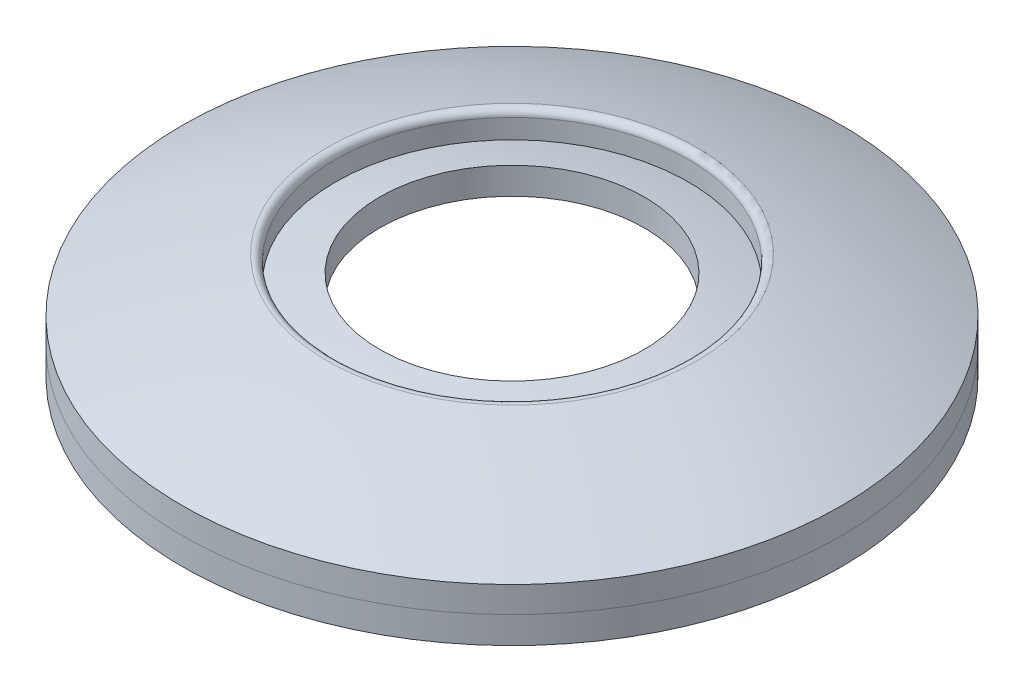
ISO-10303-21;
HEADER;
FILE_DESCRIPTION(('STEP AP214'),'2;1');
FILE_NAME('part.step','',(''),(''),'','','');
FILE_SCHEMA(('AUTOMOTIVE_DESIGN { 1 0 10303 214 1 1 1 1 }'));
ENDSEC;
DATA;
#1=APPLICATION_CONTEXT('core data for automotive mechanical design processes');
#2=APPLICATION_PROTOCOL_DEFINITION('international standard','automotive_design',2000,#1);
#3=PRODUCT_CONTEXT('',#1,'mechanical');
#4=PRODUCT('Part','Part','',(#3));
#5=PRODUCT_RELATED_PRODUCT_CATEGORY('part','',(#4));
#6=PRODUCT_DEFINITION_FORMATION('','',#4);
#7=PRODUCT_DEFINITION_CONTEXT('part definition',#1,'design');
#8=PRODUCT_DEFINITION('design','',#6,#7);
#9=PRODUCT_DEFINITION_SHAPE('','',#8);
#10=(LENGTH_UNIT() NAMED_UNIT(*) SI_UNIT(.MILLI.,.METRE.));
#11=(NAMED_UNIT(*) PLANE_ANGLE_UNIT() SI_UNIT($,.RADIAN.));
#12=(NAMED_UNIT(*) SI_UNIT($,.STERADIAN.) SOLID_ANGLE_UNIT());
#13=UNCERTAINTY_MEASURE_WITH_UNIT(LENGTH_MEASURE(1.E-05),#10,'distance_accuracy_value','');
#14=(GEOMETRIC_REPRESENTATION_CONTEXT(3) GLOBAL_UNCERTAINTY_ASSIGNED_CONTEXT((#13)) GLOBAL_UNIT_ASSIGNED_CONTEXT((#10,
#11,#12)) REPRESENTATION_CONTEXT('',''));
#15=CARTESIAN_POINT('',(0.,0.,0.));
#16=DIRECTION('',(0.,0.,1.));
#17=DIRECTION('',(1.,0.,0.));
#18=AXIS2_PLACEMENT_3D('',#15,#16,#17);
#19=CARTESIAN_POINT('',(-10.287,-0.819150000000003,0.));
#20=DIRECTION('',(0.,-1.,0.));
#21=DIRECTION('',(1.,0.,0.));
#22=AXIS2_PLACEMENT_3D('',#19,#20,#21);
#23=PLANE('',#22);
#24=CARTESIAN_POINT('',(0.,-0.81915,0.));
#25=DIRECTION('',(0.,-1.,0.));
#26=DIRECTION('',(1.,0.,0.));
#27=AXIS2_PLACEMENT_3D('',#24,#25,#26);
#28=CIRCLE('',#27,10.287);
#29=CARTESIAN_POINT('',(10.287,-0.819149999999999,0.));
#30=VERTEX_POINT('',#29);
#31=EDGE_CURVE('E83',#30,#30,#28,.T.);
#32=ORIENTED_EDGE('',*,*,#31,.F.);
#33=EDGE_LOOP('',(#32));
#34=FACE_BOUND('',#33,.T.);
#35=CARTESIAN_POINT('',(0.,-0.819150000000003,0.));
#36=DIRECTION('',(0.,-1.,0.));
#37=DIRECTION('',(1.,0.,0.));
#38=AXIS2_PLACEMENT_3D('',#35,#36,#37);
#39=CIRCLE('',#38,10.1546963657216);
#40=CARTESIAN_POINT('',(-10.1546963657216,-0.819150000000005,0.));
#41=VERTEX_POINT('',#40);
#42=EDGE_CURVE('E11',#41,#41,#39,.T.);
#43=ORIENTED_EDGE('',*,*,#42,.T.);
#44=EDGE_LOOP('',(#43));
#45=FACE_BOUND('',#44,.T.);
#46=ADVANCED_FACE('F55',(#34,#45),#23,.F.);
#47=CARTESIAN_POINT('',(0.,-21.8475870229007,0.));
#48=DIRECTION('',(0.,-1.,0.));
#49=DIRECTION('',(-1.,0.,0.));
#50=AXIS2_PLACEMENT_3D('',#47,#48,#49);
#51=SPHERICAL_SURFACE('',#50,23.3519382901313);
#52=CARTESIAN_POINT('',(0.,1.13668511384752,0.));
#53=DIRECTION('',(0.,-1.,0.));
#54=DIRECTION('',(1.,0.,0.));
#55=AXIS2_PLACEMENT_3D('',#52,#53,#54);
#56=CIRCLE('',#55,4.1275);
#57=CARTESIAN_POINT('',(-4.1275,1.13668511384753,0.));
#58=VERTEX_POINT('',#57);
#59=EDGE_CURVE('E62',#58,#58,#56,.T.);
#60=CARTESIAN_POINT('',(-10.1546963657216,-0.819150000000005,0.));
#61=CARTESIAN_POINT('',(-10.0950738926482,-0.79035811780622,0.));
#62=CARTESIAN_POINT('',(-10.0353289618888,-0.761819822343253,0.));
#63=CARTESIAN_POINT('',(-9.9155985213453,-0.705252440603446,0.));
#64=CARTESIAN_POINT('',(-9.85561301156113,-0.677223354326605,0.));
#65=CARTESIAN_POINT('',(-9.73540574931505,-0.62167642668354,0.));
#66=CARTESIAN_POINT('',(-9.67518399685315,-0.594158585317315,0.));
#67=CARTESIAN_POINT('',(-9.55450860735511,-0.539636136359009,0.));
#68=CARTESIAN_POINT('',(-9.49405497031897,-0.512631528766927,0.));
#69=CARTESIAN_POINT('',(-9.37292018530338,-0.45913750173247,0.));
#70=CARTESIAN_POINT('',(-9.31223903732392,-0.432648082290095,0.));
#71=CARTESIAN_POINT('',(-9.19065362084817,-0.380186347947361,0.));
#72=CARTESIAN_POINT('',(-9.12974935235188,-0.354214033047004,0.));
#73=CARTESIAN_POINT('',(-9.00772210132224,-0.302788386957372,0.));
#74=CARTESIAN_POINT('',(-8.9465991187889,-0.277335055768097,0.));
#75=CARTESIAN_POINT('',(-8.82413886201324,-0.226949218669709,0.));
#76=CARTESIAN_POINT('',(-8.76280158777091,-0.202016712760596,0.));
#77=CARTESIAN_POINT('',(-8.63991718540318,-0.152674330122883,0.));
#78=CARTESIAN_POINT('',(-8.57837005727778,-0.128264453394283,0.));
#79=CARTESIAN_POINT('',(-8.45507040015468,-0.0799690952014429,0.));
#80=CARTESIAN_POINT('',(-8.39331787115699,-0.0560836137372026,0.));
#81=CARTESIAN_POINT('',(-8.26961188016067,-0.00883877421725313,0.));
#82=CARTESIAN_POINT('',(-8.20765841816205,0.0145205838384562,0.));
#83=CARTESIAN_POINT('',(-8.08355504357309,0.0607114864631023,0.));
#84=CARTESIAN_POINT('',(-8.02140513098275,0.0835430310320392,0.));
#85=CARTESIAN_POINT('',(-7.896913351833,0.128676654792788,0.));
#86=CARTESIAN_POINT('',(-7.83457148527358,0.150978733984599,0.));
#87=CARTESIAN_POINT('',(-7.70970030869642,0.19505181340823,0.));
#88=CARTESIAN_POINT('',(-7.64717099867867,0.216822813640049,0.));
#89=CARTESIAN_POINT('',(-7.52192945925735,0.259832159985048,0.));
#90=CARTESIAN_POINT('',(-7.45921722985377,0.281070506098227,0.));
#91=CARTESIAN_POINT('',(-7.33361438896775,0.323013007585472,0.));
#92=CARTESIAN_POINT('',(-7.2707237774853,0.343717162959538,0.));
#93=CARTESIAN_POINT('',(-7.14476872265465,0.384589784997444,0.));
#94=CARTESIAN_POINT('',(-7.08170427930644,0.404758251661285,0.));
#95=CARTESIAN_POINT('',(-6.95540612353433,0.444558037065364,0.));
#96=CARTESIAN_POINT('',(-6.89217241111043,0.464189355805603,0.));
#97=CARTESIAN_POINT('',(-6.76554029222382,0.502913425012416,0.));
#98=CARTESIAN_POINT('',(-6.70214188576111,0.52200617547899,0.));
#99=CARTESIAN_POINT('',(-6.57518496574959,0.559651726754485,0.));
#100=CARTESIAN_POINT('',(-6.51162645220078,0.578204527563407,0.));
#101=CARTESIAN_POINT('',(-6.38435391655371,0.614768837205635,0.));
#102=CARTESIAN_POINT('',(-6.32063989445545,0.632780346038942,0.));
#103=CARTESIAN_POINT('',(-6.19306095149737,0.668260768575128,0.));
#104=CARTESIAN_POINT('',(-6.12919603063755,0.685729682278006,0.));
#105=CARTESIAN_POINT('',(-6.00131991086193,0.720123650655881,0.));
#106=CARTESIAN_POINT('',(-5.93730871194614,0.737048705330877,0.));
#107=CARTESIAN_POINT('',(-5.80914466734761,0.770353731104682,0.));
#108=CARTESIAN_POINT('',(-5.74499182166487,0.786733702203491,0.));
#109=CARTESIAN_POINT('',(-5.61654912506961,0.81894737571302,0.));
#110=CARTESIAN_POINT('',(-5.55225927415708,0.834781078123742,0.));
#111=CARTESIAN_POINT('',(-5.42354721855265,0.865901068672377,0.));
#112=CARTESIAN_POINT('',(-5.35912501386074,0.881187356810291,0.));
#113=CARTESIAN_POINT('',(-5.23015291172109,0.911211412819875,0.));
#114=CARTESIAN_POINT('',(-5.16560301427336,0.925949180691544,0.));
#115=CARTESIAN_POINT('',(-5.03638019689478,0.954875129916617,0.));
#116=CARTESIAN_POINT('',(-4.97170727696393,0.96906331127002,0.));
#117=CARTESIAN_POINT('',(-4.84224309375379,0.996889060763397,0.));
#118=CARTESIAN_POINT('',(-4.77745183047449,1.01052662890337,0.));
#119=CARTESIAN_POINT('',(-4.6477556484095,1.0372501658826,0.));
#120=CARTESIAN_POINT('',(-4.58285072962381,1.05033613472185,0.));
#121=CARTESIAN_POINT('',(-4.45293193206963,1.0759555240463,0.));
#122=CARTESIAN_POINT('',(-4.38791805330115,1.08848894453151,0.));
#123=CARTESIAN_POINT('',(-4.25778604120954,1.11300233880146,0.));
#124=CARTESIAN_POINT('',(-4.1926679078864,1.1249823125862,0.));
#125=CARTESIAN_POINT('',(-4.1275,1.13668511384753,0.));
#126=B_SPLINE_CURVE_WITH_KNOTS('',3,(#60,#61,#62,#63,#64,#65,#66,#67,#68,#69,#70,#71,#72,#73,
#74,#75,#76,#77,#78,#79,#80,#81,#82,#83,#84,#85,#86,#87,#88,#89,#90,#91,#92,#93,#94,#95,#96,#97,
#98,#99,#100,#101,#102,#103,#104,#105,#106,#107,#108,#109,#110,#111,#112,#113,#114,#115,#116,
#117,#118,#119,#120,#121,#122,#123,#124,#125),.UNSPECIFIED.,.F.,.F.,(4,2,2,2,2,2,2,2,2,2,2,2,2,
2,2,2,2,2,2,2,2,2,2,2,2,2,2,2,2,2,2,2,4),(0.,0.198630481113823,0.397260962227645,
0.595891443341466,0.794521924455287,0.993152405569116,1.19178288668294,1.39041336779676,
1.58904384891058,1.78767433002441,1.98630481113823,2.18493529225205,2.38356577336588,
2.5821962544797,2.78082673559353,2.97945721670735,3.17808769782117,3.37671817893499,
3.57534866004881,3.77397914116264,3.97260962227646,4.17124010339029,4.36987058450411,
4.56850106561793,4.76713154673175,4.96576202784558,5.1643925089594,5.36302299007322,
5.56165347118705,5.76028395230087,5.9589144334147,6.15754491452852,6.35617539564234),.UNSPECIFIED.);
#127=EDGE_CURVE('BSEAM90',#41,#58,#126,.T.);
#128=ORIENTED_EDGE('',*,*,#42,.F.);
#129=ORIENTED_EDGE('',*,*,#59,.T.);
#130=ORIENTED_EDGE('',*,*,#127,.T.);
#131=ORIENTED_EDGE('',*,*,#127,.F.);
#132=EDGE_LOOP('',(#128,#130,#129,#131));
#133=FACE_BOUND('',#132,.T.);
#134=ADVANCED_FACE('F90',(#133),#51,.T.);
#135=CARTESIAN_POINT('',(0.,-1.65735,0.));
#136=DIRECTION('',(0.,-1.,0.));
#137=DIRECTION('',(1.,0.,0.));
#138=AXIS2_PLACEMENT_3D('',#135,#136,#137);
#139=CYLINDRICAL_SURFACE('',#138,4.1275);
#140=ORIENTED_EDGE('',*,*,#59,.F.);
#141=EDGE_LOOP('',(#140));
#142=FACE_BOUND('',#141,.T.);
#143=CARTESIAN_POINT('',(0.,0.298485113847527,0.));
#144=DIRECTION('',(0.,-1.,0.));
#145=DIRECTION('',(1.,0.,0.));
#146=AXIS2_PLACEMENT_3D('',#143,#144,#145);
#147=CIRCLE('',#146,4.1275);
#148=CARTESIAN_POINT('',(-4.1275,0.298485113847526,0.));
#149=VERTEX_POINT('',#148);
#150=EDGE_CURVE('E68',#149,#149,#147,.T.);
#151=ORIENTED_EDGE('',*,*,#150,.T.);
#152=EDGE_LOOP('',(#151));
#153=FACE_BOUND('',#152,.T.);
#154=ADVANCED_FACE('F95',(#142,#153),#139,.F.);
#155=CARTESIAN_POINT('',(0.,-21.8475870229007,0.));
#156=DIRECTION('',(0.,-1.,0.));
#157=DIRECTION('',(-1.,0.,0.));
#158=AXIS2_PLACEMENT_3D('',#155,#156,#157);
#159=SPHERICAL_SURFACE('',#158,22.5274225630909);
#160=CARTESIAN_POINT('',(0.,-1.65735,0.));
#161=DIRECTION('',(0.,-1.,0.));
#162=DIRECTION('',(1.,0.,0.));
#163=AXIS2_PLACEMENT_3D('',#160,#161,#162);
#164=CIRCLE('',#163,9.99195157590079);
#165=CARTESIAN_POINT('',(-9.99195157590079,-1.65735,0.));
#166=VERTEX_POINT('',#165);
#167=EDGE_CURVE('E74',#166,#166,#164,.T.);
#168=CARTESIAN_POINT('',(-4.1275,0.298485113847526,0.));
#169=CARTESIAN_POINT('',(-4.19100603225403,0.286649110598296,0.));
#170=CARTESIAN_POINT('',(-4.25446115036335,0.274539928465392,0.));
#171=CARTESIAN_POINT('',(-4.38126486834854,0.249776134439432,0.));
#172=CARTESIAN_POINT('',(-4.4446134682244,0.237121522546375,0.));
#173=CARTESIAN_POINT('',(-4.57119945979858,0.211267797007301,0.));
#174=CARTESIAN_POINT('',(-4.63443685149691,0.198068683361283,0.));
#175=CARTESIAN_POINT('',(-4.76079574711449,0.17112693343677,0.));
#176=CARTESIAN_POINT('',(-4.82391725103375,0.157384297158274,0.));
#177=CARTESIAN_POINT('',(-4.95003969950225,0.129356518415953,0.));
#178=CARTESIAN_POINT('',(-5.0130406440515,0.115071375952127,0.));
#179=CARTESIAN_POINT('',(-5.13891731126301,0.0859596422124376,0.));
#180=CARTESIAN_POINT('',(-5.20179303392527,0.071133050936574,0.));
#181=CARTESIAN_POINT('',(-5.32741460407258,0.0409395168093435,0.));
#182=CARTESIAN_POINT('',(-5.39016045155762,0.0255725739579765,0.));
#183=CARTESIAN_POINT('',(-5.51551762768287,-0.00570052603783919,0.));
#184=CARTESIAN_POINT('',(-5.57812895632309,-0.0216066831822878,0.));
#185=CARTESIAN_POINT('',(-5.7032124610436,-0.053957034590825,0.));
#186=CARTESIAN_POINT('',(-5.76568463712389,-0.0704012288549136,0.));
#187=CARTESIAN_POINT('',(-5.89048521330858,-0.103826437506454,0.));
#188=CARTESIAN_POINT('',(-5.95281361341297,-0.120807451893906,0.));
#189=CARTESIAN_POINT('',(-6.0773220248702,-0.155305044068187,0.));
#190=CARTESIAN_POINT('',(-6.13950203622304,-0.172821621855017,0.));
#191=CARTESIAN_POINT('',(-6.26370906838344,-0.208389044468028,0.));
#192=CARTESIAN_POINT('',(-6.325736089191,-0.22643988929421,0.));
#193=CARTESIAN_POINT('',(-6.44963254978959,-0.263074510086141,0.));
#194=CARTESIAN_POINT('',(-6.51150198958062,-0.281658286051891,0.));
#195=CARTESIAN_POINT('',(-6.63507870933707,-0.319357393782204,0.));
#196=CARTESIAN_POINT('',(-6.6967859893025,-0.338472725546767,0.));
#197=CARTESIAN_POINT('',(-6.82003382259974,-0.377233530194782,0.));
#198=CARTESIAN_POINT('',(-6.88157437593156,-0.396879003078234,0.));
#199=CARTESIAN_POINT('',(-7.00448420149262,-0.43669863604963,0.));
#200=CARTESIAN_POINT('',(-7.06585347372186,-0.456872796137575,0.));
#201=CARTESIAN_POINT('',(-7.1884161952849,-0.49774831047668,0.));
#202=CARTESIAN_POINT('',(-7.24960964461871,-0.518449664727841,0.));
#203=CARTESIAN_POINT('',(-7.37181619161024,-0.560378035335733,0.));
#204=CARTESIAN_POINT('',(-7.43282928926797,-0.581605051692464,0.));
#205=CARTESIAN_POINT('',(-7.55467061747413,-0.624583175550847,0.));
#206=CARTESIAN_POINT('',(-7.61549884802255,-0.6463342830525,0.));
#207=CARTESIAN_POINT('',(-7.73696594025843,-0.690358979453358,0.));
#208=CARTESIAN_POINT('',(-7.79760480194588,-0.712632568352564,0.));
#209=CARTESIAN_POINT('',(-7.91868866872289,-0.757700579133554,0.));
#210=CARTESIAN_POINT('',(-7.97913367381244,-0.780495001015339,0.));
#211=CARTESIAN_POINT('',(-8.09982535400358,-0.826602990800903,0.));
#212=CARTESIAN_POINT('',(-8.16007202910517,-0.849916558704684,0.));
#213=CARTESIAN_POINT('',(-8.28036259060823,-0.897061115152971,0.));
#214=CARTESIAN_POINT('',(-8.3404064770097,-0.920892103697477,0.));
#215=CARTESIAN_POINT('',(-8.46028701740837,-0.969069737752615,0.));
#216=CARTESIAN_POINT('',(-8.52012367140558,-0.993416383263247,0.));
#217=CARTESIAN_POINT('',(-8.6395853186279,-1.04262352941449,0.));
#218=CARTESIAN_POINT('',(-8.69921031185302,-1.0674840300551,0.));
#219=CARTESIAN_POINT('',(-8.81824422482961,-1.11771704659728,0.));
#220=CARTESIAN_POINT('',(-8.87765314458109,-1.14308956249886,0.));
#221=CARTESIAN_POINT('',(-8.99625051389329,-1.19434473181465,0.));
#222=CARTESIAN_POINT('',(-9.05543896345402,-1.22022738522887,0.));
#223=CARTESIAN_POINT('',(-9.17359101200887,-1.27250091401641,0.));
#224=CARTESIAN_POINT('',(-9.23255461100298,-1.29889178938974,0.));
#225=CARTESIAN_POINT('',(-9.35025259459696,-1.35217980912054,0.));
#226=CARTESIAN_POINT('',(-9.40898697919683,-1.379076953478,0.));
#227=CARTESIAN_POINT('',(-9.52622218748315,-1.43337552002218,0.));
#228=CARTESIAN_POINT('',(-9.58472301116961,-1.46077694220889,0.));
#229=CARTESIAN_POINT('',(-9.70148676710827,-1.516082038594,0.));
#230=CARTESIAN_POINT('',(-9.75974969936048,-1.5439857127924,0.));
#231=CARTESIAN_POINT('',(-9.87603336431848,-1.60029324029416,0.));
#232=CARTESIAN_POINT('',(-9.93405409702428,-1.62869709359752,0.));
#233=CARTESIAN_POINT('',(-9.99195157590079,-1.65735,0.));
#234=B_SPLINE_CURVE_WITH_KNOTS('',3,(#168,#169,#170,#171,#172,#173,#174,#175,#176,#177,#178,
#179,#180,#181,#182,#183,#184,#185,#186,#187,#188,#189,#190,#191,#192,#193,#194,#195,#196,#197,
#198,#199,#200,#201,#202,#203,#204,#205,#206,#207,#208,#209,#210,#211,#212,#213,#214,#215,#216,
#217,#218,#219,#220,#221,#222,#223,#224,#225,#226,#227,#228,#229,#230,#231,#232,#233),
.UNSPECIFIED.,.F.,.F.,(4,2,2,2,2,2,2,2,2,2,2,2,2,2,2,2,2,2,2,2,2,2,2,2,2,2,2,2,2,2,2,2,4),(0.,
0.193798174001697,0.387596348003394,0.581394522005092,0.77519269600679,0.968990870008488,
1.16278904401019,1.35658721801188,1.55038539201358,1.74418356601528,1.93798174001698,
2.13177991401868,2.32557808802038,2.51937626202208,2.71317443602377,2.90697261002547,
3.10077078402717,3.29456895802887,3.48836713203056,3.68216530603226,3.87596348003396,
4.06976165403566,4.26355982803736,4.45735800203906,4.65115617604075,4.84495435004245,
5.03875252404415,5.23255069804585,5.42634887204755,5.62014704604924,5.81394522005094,
6.00774339405264,6.20154156805434),.UNSPECIFIED.);
#235=EDGE_CURVE('BSEAM99',#149,#166,#234,.T.);
#236=ORIENTED_EDGE('',*,*,#150,.F.);
#237=ORIENTED_EDGE('',*,*,#167,.T.);
#238=ORIENTED_EDGE('',*,*,#235,.T.);
#239=ORIENTED_EDGE('',*,*,#235,.F.);
#240=EDGE_LOOP('',(#236,#238,#237,#239));
#241=FACE_BOUND('',#240,.T.);
#242=ADVANCED_FACE('F99',(#241),#159,.F.);
#243=CARTESIAN_POINT('',(-10.287,-1.65735,0.));
#244=DIRECTION('',(0.,1.,0.));
#245=DIRECTION('',(-1.,0.,0.));
#246=AXIS2_PLACEMENT_3D('',#243,#244,#245);
#247=PLANE('',#246);
#248=ORIENTED_EDGE('',*,*,#167,.F.);
#249=EDGE_LOOP('',(#248));
#250=FACE_BOUND('',#249,.T.);
#251=CARTESIAN_POINT('',(0.,-1.65735,0.));
#252=DIRECTION('',(0.,-1.,0.));
#253=DIRECTION('',(1.,0.,0.));
#254=AXIS2_PLACEMENT_3D('',#251,#252,#253);
#255=CIRCLE('',#254,10.287);
#256=CARTESIAN_POINT('',(10.287,-1.65735,0.));
#257=VERTEX_POINT('',#256);
#258=EDGE_CURVE('E80',#257,#257,#255,.T.);
#259=ORIENTED_EDGE('',*,*,#258,.T.);
#260=EDGE_LOOP('',(#259));
#261=FACE_BOUND('',#260,.T.);
#262=ADVANCED_FACE('F104',(#250,#261),#247,.F.);
#263=CARTESIAN_POINT('',(0.,-1.65735,0.));
#264=DIRECTION('',(0.,-1.,0.));
#265=DIRECTION('',(1.,0.,0.));
#266=AXIS2_PLACEMENT_3D('',#263,#264,#265);
#267=CYLINDRICAL_SURFACE('',#266,10.287);
#268=ORIENTED_EDGE('',*,*,#258,.F.);
#269=EDGE_LOOP('',(#268));
#270=FACE_BOUND('',#269,.T.);
#271=ORIENTED_EDGE('',*,*,#31,.T.);
#272=EDGE_LOOP('',(#271));
#273=FACE_BOUND('',#272,.T.);
#274=ADVANCED_FACE('F87',(#270,#273),#267,.T.);
#275=CLOSED_SHELL('',(#46,#134,#154,#242,#262,#274));
#276=MANIFOLD_SOLID_BREP('B2',#275);
#277=CARTESIAN_POINT('',(-10.287,-0.819150000000001,0.));
#278=DIRECTION('',(0.,1.,0.));
#279=DIRECTION('',(-1.,0.,0.));
#280=AXIS2_PLACEMENT_3D('',#277,#278,#279);
#281=PLANE('',#280);
#282=CARTESIAN_POINT('',(0.,-0.81915,0.));
#283=DIRECTION('',(0.,-1.,0.));
#284=DIRECTION('',(1.,0.,0.));
#285=AXIS2_PLACEMENT_3D('',#282,#283,#284);
#286=CIRCLE('',#285,10.1546963657216);
#287=CARTESIAN_POINT('',(-10.1546963657216,-0.819150000000001,0.));
#288=VERTEX_POINT('',#287);
#289=EDGE_CURVE('E54',#288,#288,#286,.T.);
#290=ORIENTED_EDGE('',*,*,#289,.F.);
#291=EDGE_LOOP('',(#290));
#292=FACE_BOUND('',#291,.T.);
#293=CARTESIAN_POINT('',(0.,-0.81915,0.));
#294=DIRECTION('',(0.,-1.,0.));
#295=DIRECTION('',(1.,0.,0.));
#296=AXIS2_PLACEMENT_3D('',#293,#294,#295);
#297=CIRCLE('',#296,10.287);
#298=CARTESIAN_POINT('',(10.287,-0.819149999999998,0.));
#299=VERTEX_POINT('',#298);
#300=EDGE_CURVE('E171',#299,#299,#297,.T.);
#301=ORIENTED_EDGE('',*,*,#300,.T.);
#302=EDGE_LOOP('',(#301));
#303=FACE_BOUND('',#302,.T.);
#304=ADVANCED_FACE('F143',(#292,#303),#281,.F.);
#305=CARTESIAN_POINT('',(0.,-21.8475870229008,0.));
#306=DIRECTION('',(0.,-1.,0.));
#307=DIRECTION('',(-1.,0.,0.));
#308=AXIS2_PLACEMENT_3D('',#305,#306,#307);
#309=SPHERICAL_SURFACE('',#308,23.3519382901314);
#310=CARTESIAN_POINT('',(0.,0.84455,0.));
#311=DIRECTION('',(0.,-1.,0.));
#312=DIRECTION('',(1.,0.,0.));
#313=AXIS2_PLACEMENT_3D('',#310,#311,#312);
#314=CIRCLE('',#313,5.5118);
#315=CARTESIAN_POINT('',(-5.51180000000002,0.844549999999996,0.));
#316=VERTEX_POINT('',#315);
#317=EDGE_CURVE('E150',#316,#316,#314,.T.);
#318=CARTESIAN_POINT('',(-5.51180000000002,0.844549999999996,0.));
#319=CARTESIAN_POINT('',(-5.56181642683611,0.832401277349449,0.));
#320=CARTESIAN_POINT('',(-5.61179268634412,0.820087185527644,0.));
#321=CARTESIAN_POINT('',(-5.71166268840982,0.795128813343484,0.));
#322=CARTESIAN_POINT('',(-5.76155643096751,0.782484532981127,0.));
#323=CARTESIAN_POINT('',(-5.86125921683842,0.756866333517823,0.));
#324=CARTESIAN_POINT('',(-5.91106826015165,0.743892414416875,0.));
#325=CARTESIAN_POINT('',(-6.01059946990958,0.71761550555972,0.));
#326=CARTESIAN_POINT('',(-6.06032163635429,0.704312515803513,0.));
#327=CARTESIAN_POINT('',(-6.15967691829067,0.677378047070767,0.));
#328=CARTESIAN_POINT('',(-6.20931003378234,0.663746568094229,0.));
#329=CARTESIAN_POINT('',(-6.30848504369115,0.636155716996214,0.));
#330=CARTESIAN_POINT('',(-6.35802693810829,0.622196344874737,0.));
#331=CARTESIAN_POINT('',(-6.45701733971647,0.593950317824459,0.));
#332=CARTESIAN_POINT('',(-6.5064658469075,0.579663662895658,0.));
#333=CARTESIAN_POINT('',(-6.60526731200007,0.550763694898265,0.));
#334=CARTESIAN_POINT('',(-6.65462026990162,0.536150381829674,0.));
#335=CARTESIAN_POINT('',(-6.75322847852827,0.506597736497539,0.));
#336=CARTESIAN_POINT('',(-6.80248372925338,0.491658404233995,0.));
#337=CARTESIAN_POINT('',(-6.90089436991265,0.461454373712947,0.));
#338=CARTESIAN_POINT('',(-6.95004975984683,0.446189675455444,0.));
#339=CARTESIAN_POINT('',(-7.04825852967592,0.415335580373235,0.));
#340=CARTESIAN_POINT('',(-7.09731190957084,0.399746183548529,0.));
#341=CARTESIAN_POINT('',(-7.19531451453337,0.368243372955762,0.));
#342=CARTESIAN_POINT('',(-7.24426373960098,0.352329959187701,0.));
#343=CARTESIAN_POINT('',(-7.34205589467485,0.320179810499204,0.));
#344=CARTESIAN_POINT('',(-7.39089882468112,0.303943075578769,0.));
#345=CARTESIAN_POINT('',(-7.48847625404585,0.271146994513268,0.));
#346=CARTESIAN_POINT('',(-7.53721075340433,0.254587648368203,0.));
#347=CARTESIAN_POINT('',(-7.63456919062802,0.221147068886892,0.));
#348=CARTESIAN_POINT('',(-7.68319312849324,0.204265835550647,0.));
#349=CARTESIAN_POINT('',(-7.78032831671909,0.170182219794476,0.));
#350=CARTESIAN_POINT('',(-7.82883956707972,0.152979837374551,0.));
#351=CARTESIAN_POINT('',(-7.92574725921217,0.118254675600301,0.));
#352=CARTESIAN_POINT('',(-7.97414370098399,0.100731896245976,0.));
#353=CARTESIAN_POINT('',(-8.07081965987442,0.0653667067611028,0.));
#354=CARTESIAN_POINT('',(-8.11909917699303,0.0475242966305548,0.));
#355=CARTESIAN_POINT('',(-8.21553917562503,0.0115206257267957,0.));
#356=CARTESIAN_POINT('',(-8.26369965713841,-0.00664063504641543,0.));
#357=CARTESIAN_POINT('',(-8.35989947881257,-0.0432812131606458,0.));
#358=CARTESIAN_POINT('',(-8.40793881897335,-0.0617605305016651,0.));
#359=CARTESIAN_POINT('',(-8.50389425749167,-0.0990364137701041,0.));
#360=CARTESIAN_POINT('',(-8.55181035584921,-0.117832979697524,0.));
#361=CARTESIAN_POINT('',(-8.64751721569898,-0.15574253828611,0.));
#362=CARTESIAN_POINT('',(-8.69530797719121,-0.174855530947277,0.));
#363=CARTESIAN_POINT('',(-8.79076207372847,-0.213397107315428,0.));
#364=CARTESIAN_POINT('',(-8.83842540877349,-0.232825691022412,0.));
#365=CARTESIAN_POINT('',(-8.93362256840599,-0.271997599995411,0.));
#366=CARTESIAN_POINT('',(-8.98115639299348,-0.291740925261426,0.));
#367=CARTESIAN_POINT('',(-9.07609245336308,-0.331541454104442,0.));
#368=CARTESIAN_POINT('',(-9.1234946891452,-0.351598657681443,0.));
#369=CARTESIAN_POINT('',(-9.21816549931038,-0.39202606617317,0.));
#370=CARTESIAN_POINT('',(-9.26543407369346,-0.412396271087896,0.));
#371=CARTESIAN_POINT('',(-9.35983549430867,-0.453448791601267,0.));
#372=CARTESIAN_POINT('',(-9.40696834054082,-0.47413110719991,0.));
#373=CARTESIAN_POINT('',(-9.50109624404563,-0.515806944762146,0.));
#374=CARTESIAN_POINT('',(-9.5480913013183,-0.536800466725737,0.));
#375=CARTESIAN_POINT('',(-9.64194157208734,-0.579097799161149,0.));
#376=CARTESIAN_POINT('',(-9.6887967855837,-0.60040160963297,0.));
#377=CARTESIAN_POINT('',(-9.78236532022055,-0.643318587402589,0.));
#378=CARTESIAN_POINT('',(-9.82907864136104,-0.664931754700388,0.));
#379=CARTESIAN_POINT('',(-9.92236134845236,-0.708466501878693,0.));
#380=CARTESIAN_POINT('',(-9.96893073440319,-0.730388081759199,0.));
#381=CARTESIAN_POINT('',(-10.0619235362849,-0.774538692772744,0.));
#382=CARTESIAN_POINT('',(-10.1083469522158,-0.796767723905783,0.));
#383=CARTESIAN_POINT('',(-10.1546963657216,-0.819150000000001,0.));
#384=B_SPLINE_CURVE_WITH_KNOTS('',3,(#318,#319,#320,#321,#322,#323,#324,#325,#326,#327,#328,
#329,#330,#331,#332,#333,#334,#335,#336,#337,#338,#339,#340,#341,#342,#343,#344,#345,#346,#347,
#348,#349,#350,#351,#352,#353,#354,#355,#356,#357,#358,#359,#360,#361,#362,#363,#364,#365,#366,
#367,#368,#369,#370,#371,#372,#373,#374,#375,#376,#377,#378,#379,#380,#381,#382,#383),
.UNSPECIFIED.,.F.,.F.,(4,2,2,2,2,2,2,2,2,2,2,2,2,2,2,2,2,2,2,2,2,2,2,2,2,2,2,2,2,2,2,2,4),(0.,
0.154411861098502,0.308823722197,0.463235583295502,0.617647444394004,0.772059305492501,
0.926471166591003,1.08088302768951,1.23529488878801,1.38970674988651,1.54411861098501,
1.69853047208351,1.85294233318201,2.00735419428051,2.16176605537901,2.31617791647751,
2.47058977757601,2.62500163867452,2.77941349977301,2.93382536087152,3.08823722197002,
3.24264908306851,3.39706094416702,3.55147280526552,3.70588466636402,3.86029652746252,
4.01470838856102,4.16912024965952,4.32353211075802,4.47794397185652,4.63235583295503,
4.78676769405352,4.94117955515202),.UNSPECIFIED.);
#385=EDGE_CURVE('BSEAM196',#316,#288,#384,.T.);
#386=ORIENTED_EDGE('',*,*,#317,.F.);
#387=ORIENTED_EDGE('',*,*,#289,.T.);
#388=ORIENTED_EDGE('',*,*,#385,.T.);
#389=ORIENTED_EDGE('',*,*,#385,.F.);
#390=EDGE_LOOP('',(#386,#388,#387,#389));
#391=FACE_BOUND('',#390,.T.);
#392=ADVANCED_FACE('F196',(#391),#309,.F.);
#393=CARTESIAN_POINT('',(0.,-1.65735,0.));
#394=DIRECTION('',(0.,-1.,0.));
#395=DIRECTION('',(1.,0.,0.));
#396=AXIS2_PLACEMENT_3D('',#393,#394,#395);
#397=CYLINDRICAL_SURFACE('',#396,5.5118);
#398=CARTESIAN_POINT('',(0.,1.45161,0.));
#399=DIRECTION('',(0.,-1.,0.));
#400=DIRECTION('',(1.,0.,0.));
#401=AXIS2_PLACEMENT_3D('',#398,#399,#400);
#402=CIRCLE('',#401,5.5118);
#403=CARTESIAN_POINT('',(5.5118,1.45161,0.));
#404=VERTEX_POINT('',#403);
#405=EDGE_CURVE('E157',#404,#404,#402,.T.);
#406=ORIENTED_EDGE('',*,*,#405,.F.);
#407=EDGE_LOOP('',(#406));
#408=FACE_BOUND('',#407,.T.);
#409=ORIENTED_EDGE('',*,*,#317,.T.);
#410=EDGE_LOOP('',(#409));
#411=FACE_BOUND('',#410,.T.);
#412=ADVANCED_FACE('F191',(#408,#411),#397,.F.);
#413=CARTESIAN_POINT('',(0.,1.45161,0.));
#414=DIRECTION('',(0.,-1.,0.));
#415=DIRECTION('',(1.,0.,0.));
#416=AXIS2_PLACEMENT_3D('',#413,#414,#415);
#417=TOROIDAL_SURFACE('',#416,5.71754,0.205740000000004);
#418=CARTESIAN_POINT('',(0.,1.65027450611253,0.));
#419=DIRECTION('',(0.,-1.,0.));
#420=DIRECTION('',(1.,0.,0.));
#421=AXIS2_PLACEMENT_3D('',#418,#419,#420);
#422=CIRCLE('',#421,5.77103169665531);
#423=CARTESIAN_POINT('',(5.77103169665531,1.65027450611253,0.));
#424=VERTEX_POINT('',#423);
#425=EDGE_CURVE('E162',#424,#424,#422,.T.);
#426=ORIENTED_EDGE('',*,*,#425,.F.);
#427=EDGE_LOOP('',(#426));
#428=FACE_BOUND('',#427,.T.);
#429=ORIENTED_EDGE('',*,*,#405,.T.);
#430=EDGE_LOOP('',(#429));
#431=FACE_BOUND('',#430,.T.);
#432=ADVANCED_FACE('F185',(#428,#431),#417,.T.);
#433=CARTESIAN_POINT('',(0.,-24.6032973036302,0.));
#434=DIRECTION('',(0.,-1.,0.));
#435=DIRECTION('',(1.,0.,0.));
#436=AXIS2_PLACEMENT_3D('',#433,#434,#435);
#437=DEGENERATE_TOROIDAL_SURFACE('',#436,1.29791145199972,27.1886003686883,.F.);
#438=CARTESIAN_POINT('',(0.,-0.00635000000000045,0.));
#439=DIRECTION('',(0.,-1.,0.));
#440=DIRECTION('',(1.,0.,0.));
#441=AXIS2_PLACEMENT_3D('',#438,#439,#440);
#442=CIRCLE('',#441,10.287);
#443=CARTESIAN_POINT('',(10.287,-0.00634999999999919,0.));
#444=VERTEX_POINT('',#443);
#445=EDGE_CURVE('E168',#444,#444,#442,.T.);
#446=ORIENTED_EDGE('',*,*,#445,.F.);
#447=EDGE_LOOP('',(#446));
#448=FACE_BOUND('',#447,.T.);
#449=ORIENTED_EDGE('',*,*,#425,.T.);
#450=EDGE_LOOP('',(#449));
#451=FACE_BOUND('',#450,.T.);
#452=ADVANCED_FACE('F179',(#448,#451),#437,.F.);
#453=CARTESIAN_POINT('',(0.,-1.65735,0.));
#454=DIRECTION('',(0.,-1.,0.));
#455=DIRECTION('',(1.,0.,0.));
#456=AXIS2_PLACEMENT_3D('',#453,#454,#455);
#457=CYLINDRICAL_SURFACE('',#456,10.287);
#458=ORIENTED_EDGE('',*,*,#300,.F.);
#459=EDGE_LOOP('',(#458));
#460=FACE_BOUND('',#459,.T.);
#461=ORIENTED_EDGE('',*,*,#445,.T.);
#462=EDGE_LOOP('',(#461));
#463=FACE_BOUND('',#462,.T.);
#464=ADVANCED_FACE('F176',(#460,#463),#457,.T.);
#465=CLOSED_SHELL('',(#304,#392,#412,#432,#452,#464));
#466=MANIFOLD_SOLID_BREP('B6',#465);
#467=ADVANCED_BREP_SHAPE_REPRESENTATION('',(#18,#276,#466),#14);
#468=SHAPE_DEFINITION_REPRESENTATION(#9,#467);
ENDSEC;
END-ISO-10303-21;
